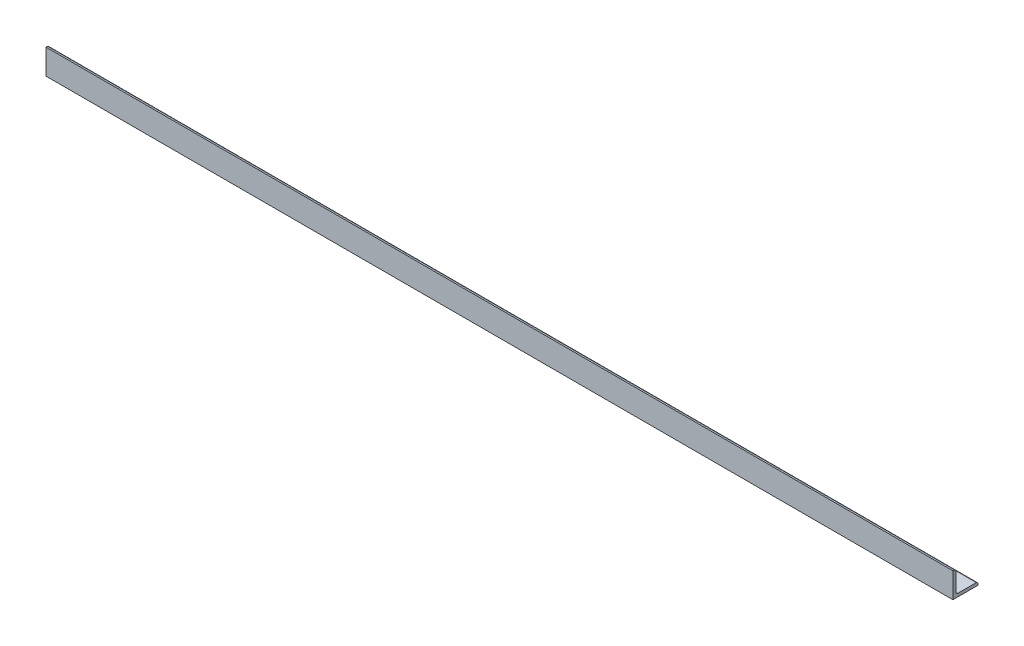
ISO-10303-21;
HEADER;
FILE_DESCRIPTION(('STEP AP214'),'2;1');
FILE_NAME('part.step','',(''),(''),'','','');
FILE_SCHEMA(('AUTOMOTIVE_DESIGN { 1 0 10303 214 1 1 1 1 }'));
ENDSEC;
DATA;
#1=APPLICATION_CONTEXT('core data for automotive mechanical design processes');
#2=APPLICATION_PROTOCOL_DEFINITION('international standard','automotive_design',2000,#1);
#3=PRODUCT_CONTEXT('',#1,'mechanical');
#4=PRODUCT('Part','Part','',(#3));
#5=PRODUCT_RELATED_PRODUCT_CATEGORY('part','',(#4));
#6=PRODUCT_DEFINITION_FORMATION('','',#4);
#7=PRODUCT_DEFINITION_CONTEXT('part definition',#1,'design');
#8=PRODUCT_DEFINITION('design','',#6,#7);
#9=PRODUCT_DEFINITION_SHAPE('','',#8);
#10=(LENGTH_UNIT() NAMED_UNIT(*) SI_UNIT(.MILLI.,.METRE.));
#11=(NAMED_UNIT(*) PLANE_ANGLE_UNIT() SI_UNIT($,.RADIAN.));
#12=(NAMED_UNIT(*) SI_UNIT($,.STERADIAN.) SOLID_ANGLE_UNIT());
#13=UNCERTAINTY_MEASURE_WITH_UNIT(LENGTH_MEASURE(1.E-05),#10,'distance_accuracy_value','');
#14=(GEOMETRIC_REPRESENTATION_CONTEXT(3) GLOBAL_UNCERTAINTY_ASSIGNED_CONTEXT((#13)) GLOBAL_UNIT_ASSIGNED_CONTEXT((#10,
#11,#12)) REPRESENTATION_CONTEXT('',''));
#15=CARTESIAN_POINT('',(0.,0.,0.));
#16=DIRECTION('',(0.,0.,1.));
#17=DIRECTION('',(1.,0.,0.));
#18=AXIS2_PLACEMENT_3D('',#15,#16,#17);
#19=CARTESIAN_POINT('',(150.460652388512,-310.689072168843,-670.15));
#20=DIRECTION('',(0.,-1.,0.));
#21=DIRECTION('',(0.,0.,-1.));
#22=AXIS2_PLACEMENT_3D('',#19,#20,#21);
#23=CYLINDRICAL_SURFACE('',#22,3.4);
#24=CARTESIAN_POINT('',(150.460652388512,-305.926572168843,-670.15));
#25=DIRECTION('',(0.,-1.,0.));
#26=DIRECTION('',(0.,0.,-1.));
#27=AXIS2_PLACEMENT_3D('',#24,#25,#26);
#28=CIRCLE('',#27,3.4);
#29=CARTESIAN_POINT('',(150.460652388512,-305.926572168843,-673.55));
#30=VERTEX_POINT('',#29);
#31=EDGE_CURVE('E20',#30,#30,#28,.F.);
#32=ORIENTED_EDGE('',*,*,#31,.T.);
#33=EDGE_LOOP('',(#32));
#34=FACE_BOUND('',#33,.T.);
#35=CARTESIAN_POINT('',(150.460652388512,-310.017902480979,-670.15));
#36=DIRECTION('',(0.,-1.,0.));
#37=DIRECTION('',(-1.,0.,0.));
#38=AXIS2_PLACEMENT_3D('',#35,#36,#37);
#39=CIRCLE('',#38,3.39999999999394);
#40=CARTESIAN_POINT('',(147.060652388518,-310.017902480979,-670.15));
#41=VERTEX_POINT('',#40);
#42=EDGE_CURVE('E177',#41,#41,#39,.T.);
#43=ORIENTED_EDGE('',*,*,#42,.T.);
#44=EDGE_LOOP('',(#43));
#45=FACE_BOUND('',#44,.T.);
#46=ADVANCED_FACE('F17',(#34,#45),#23,.F.);
#47=CARTESIAN_POINT('',(-150.489347611488,-310.689072168843,-670.15));
#48=DIRECTION('',(0.,-1.,0.));
#49=DIRECTION('',(0.,0.,-1.));
#50=AXIS2_PLACEMENT_3D('',#47,#48,#49);
#51=CYLINDRICAL_SURFACE('',#50,3.4);
#52=CARTESIAN_POINT('',(-150.489347611488,-305.926572168843,-670.15));
#53=DIRECTION('',(0.,-1.,0.));
#54=DIRECTION('',(0.,0.,-1.));
#55=AXIS2_PLACEMENT_3D('',#52,#53,#54);
#56=CIRCLE('',#55,3.4);
#57=CARTESIAN_POINT('',(-150.489347611488,-305.926572168843,-673.55));
#58=VERTEX_POINT('',#57);
#59=EDGE_CURVE('E150',#58,#58,#56,.F.);
#60=ORIENTED_EDGE('',*,*,#59,.T.);
#61=EDGE_LOOP('',(#60));
#62=FACE_BOUND('',#61,.T.);
#63=CARTESIAN_POINT('',(-150.489347611488,-310.017902480922,-670.15));
#64=DIRECTION('',(0.,-1.,0.));
#65=DIRECTION('',(-1.,0.,0.));
#66=AXIS2_PLACEMENT_3D('',#63,#64,#65);
#67=CIRCLE('',#66,3.39999999999421);
#68=CARTESIAN_POINT('',(-153.889347611482,-310.017902480922,-670.15));
#69=VERTEX_POINT('',#68);
#70=EDGE_CURVE('E101',#69,#69,#67,.T.);
#71=ORIENTED_EDGE('',*,*,#70,.T.);
#72=EDGE_LOOP('',(#71));
#73=FACE_BOUND('',#72,.T.);
#74=ADVANCED_FACE('F264',(#62,#73),#51,.F.);
#75=CARTESIAN_POINT('',(150.460652388512,-310.689072168884,-670.15));
#76=DIRECTION('',(0.,-1.,0.));
#77=DIRECTION('',(0.,0.,-1.));
#78=AXIS2_PLACEMENT_3D('',#75,#76,#77);
#79=CONICAL_SURFACE('',#78,4.56249999995792,1.04719755120111);
#80=CARTESIAN_POINT('',(150.460652388512,-310.689072168884,-670.15));
#81=DIRECTION('',(0.,-1.,0.));
#82=DIRECTION('',(0.,0.,-1.));
#83=AXIS2_PLACEMENT_3D('',#80,#81,#82);
#84=CIRCLE('',#83,4.56249999995795);
#85=CARTESIAN_POINT('',(150.460652388512,-310.689072168884,-674.712499999958));
#86=VERTEX_POINT('',#85);
#87=EDGE_CURVE('E168',#86,#86,#84,.T.);
#88=ORIENTED_EDGE('',*,*,#87,.T.);
#89=EDGE_LOOP('',(#88));
#90=FACE_BOUND('',#89,.T.);
#91=ORIENTED_EDGE('',*,*,#42,.F.);
#92=EDGE_LOOP('',(#91));
#93=FACE_BOUND('',#92,.T.);
#94=ADVANCED_FACE('F260',(#90,#93),#79,.F.);
#95=CARTESIAN_POINT('',(-150.489347611488,-310.689072168827,-670.15));
#96=DIRECTION('',(0.,-1.,0.));
#97=DIRECTION('',(0.,0.,-1.));
#98=AXIS2_PLACEMENT_3D('',#95,#96,#97);
#99=CONICAL_SURFACE('',#98,4.5624999999582,1.04719755120111);
#100=CARTESIAN_POINT('',(-150.489347611488,-310.689072168827,-670.15));
#101=DIRECTION('',(0.,-1.,0.));
#102=DIRECTION('',(0.,0.,-1.));
#103=AXIS2_PLACEMENT_3D('',#100,#101,#102);
#104=CIRCLE('',#103,4.56249999995817);
#105=CARTESIAN_POINT('',(-150.489347611488,-310.689072168827,-674.712499999958));
#106=VERTEX_POINT('',#105);
#107=EDGE_CURVE('E156',#106,#106,#104,.T.);
#108=ORIENTED_EDGE('',*,*,#107,.T.);
#109=EDGE_LOOP('',(#108));
#110=FACE_BOUND('',#109,.T.);
#111=ORIENTED_EDGE('',*,*,#70,.F.);
#112=EDGE_LOOP('',(#111));
#113=FACE_BOUND('',#112,.T.);
#114=ADVANCED_FACE('F257',(#110,#113),#99,.F.);
#115=CARTESIAN_POINT('',(551.510652388512,-305.926572168843,-690.15));
#116=DIRECTION('',(0.,0.,1.));
#117=DIRECTION('',(1.,0.,0.));
#118=AXIS2_PLACEMENT_3D('',#115,#116,#117);
#119=PLANE('',#118);
#120=DIRECTION('',(0.,1.,0.));
#121=VECTOR('',#120,1.);
#122=CARTESIAN_POINT('',(-861.589347611489,-310.689072168843,-690.15));
#123=LINE('',#122,#121);
#124=CARTESIAN_POINT('',(-861.589347611489,-308.926572168843,-690.15));
#125=VERTEX_POINT('',#124);
#126=CARTESIAN_POINT('',(-861.589347611489,-310.689072168843,-690.15));
#127=VERTEX_POINT('',#126);
#128=EDGE_CURVE('E163',#125,#127,#123,.F.);
#129=ORIENTED_EDGE('',*,*,#128,.F.);
#130=DIRECTION('',(-1.,0.,0.));
#131=VECTOR('',#130,1.);
#132=CARTESIAN_POINT('',(0.,-308.926572168843,-690.15));
#133=LINE('',#132,#131);
#134=CARTESIAN_POINT('',(514.610652388512,-308.926572168843,-690.15));
#135=VERTEX_POINT('',#134);
#136=EDGE_CURVE('E146',#135,#125,#133,.T.);
#137=ORIENTED_EDGE('',*,*,#136,.F.);
#138=DIRECTION('',(0.,1.,0.));
#139=VECTOR('',#138,1.);
#140=CARTESIAN_POINT('',(514.610652388512,-313.864072168843,-690.15));
#141=LINE('',#140,#139);
#142=CARTESIAN_POINT('',(514.610652388512,-310.689072168843,-690.15));
#143=VERTEX_POINT('',#142);
#144=EDGE_CURVE('E115',#143,#135,#141,.T.);
#145=ORIENTED_EDGE('',*,*,#144,.F.);
#146=DIRECTION('',(1.,0.,0.));
#147=VECTOR('',#146,1.);
#148=CARTESIAN_POINT('',(551.510652388512,-310.689072168843,-690.15));
#149=LINE('',#148,#147);
#150=EDGE_CURVE('E153',#143,#127,#149,.F.);
#151=ORIENTED_EDGE('',*,*,#150,.T.);
#152=EDGE_LOOP('',(#129,#137,#145,#151));
#153=FACE_BOUND('',#152,.T.);
#154=ADVANCED_FACE('F214',(#153),#119,.F.);
#155=CARTESIAN_POINT('',(551.510652388512,-272.589072168843,-656.8125));
#156=DIRECTION('',(0.,0.,1.));
#157=DIRECTION('',(1.,0.,0.));
#158=AXIS2_PLACEMENT_3D('',#155,#156,#157);
#159=PLANE('',#158);
#160=DIRECTION('',(0.,1.,0.));
#161=VECTOR('',#160,1.);
#162=CARTESIAN_POINT('',(514.610652388512,-313.864072168843,-656.8125));
#163=LINE('',#162,#161);
#164=CARTESIAN_POINT('',(514.610652388512,-302.926572168843,-656.8125));
#165=VERTEX_POINT('',#164);
#166=CARTESIAN_POINT('',(514.610652388512,-275.589072168843,-656.8125));
#167=VERTEX_POINT('',#166);
#168=EDGE_CURVE('E105',#165,#167,#163,.T.);
#169=ORIENTED_EDGE('',*,*,#168,.F.);
#170=DIRECTION('',(-1.,0.,0.));
#171=VECTOR('',#170,1.);
#172=CARTESIAN_POINT('',(0.,-302.926572168843,-656.8125));
#173=LINE('',#172,#171);
#174=CARTESIAN_POINT('',(-861.589347611489,-302.926572168843,-656.8125));
#175=VERTEX_POINT('',#174);
#176=EDGE_CURVE('E93',#165,#175,#173,.T.);
#177=ORIENTED_EDGE('',*,*,#176,.T.);
#178=DIRECTION('',(0.,1.,0.));
#179=VECTOR('',#178,1.);
#180=CARTESIAN_POINT('',(-861.589347611489,-310.689072168843,-656.8125));
#181=LINE('',#180,#179);
#182=CARTESIAN_POINT('',(-861.589347611489,-275.589072168843,-656.8125));
#183=VERTEX_POINT('',#182);
#184=EDGE_CURVE('E184',#183,#175,#181,.F.);
#185=ORIENTED_EDGE('',*,*,#184,.F.);
#186=DIRECTION('',(1.,0.,0.));
#187=VECTOR('',#186,1.);
#188=CARTESIAN_POINT('',(0.,-275.589072168843,-656.8125));
#189=LINE('',#188,#187);
#190=EDGE_CURVE('E111',#167,#183,#189,.F.);
#191=ORIENTED_EDGE('',*,*,#190,.F.);
#192=EDGE_LOOP('',(#169,#177,#185,#191));
#193=FACE_BOUND('',#192,.T.);
#194=ADVANCED_FACE('F110',(#193),#159,.F.);
#195=CARTESIAN_POINT('',(0.,-302.926572168843,-659.8125));
#196=DIRECTION('',(-1.,0.,0.));
#197=DIRECTION('',(0.,0.,1.));
#198=AXIS2_PLACEMENT_3D('',#195,#196,#197);
#199=CYLINDRICAL_SURFACE('',#198,3.);
#200=CARTESIAN_POINT('',(-861.589347611489,-302.926572168843,-659.8125));
#201=DIRECTION('',(-1.,0.,0.));
#202=DIRECTION('',(0.,0.,1.));
#203=AXIS2_PLACEMENT_3D('',#200,#201,#202);
#204=CIRCLE('',#203,3.);
#205=CARTESIAN_POINT('',(-861.589347611489,-305.926572168843,-659.8125));
#206=VERTEX_POINT('',#205);
#207=EDGE_CURVE('E97',#175,#206,#204,.F.);
#208=ORIENTED_EDGE('',*,*,#207,.F.);
#209=ORIENTED_EDGE('',*,*,#176,.F.);
#210=CARTESIAN_POINT('',(514.610652388512,-302.926572168843,-659.8125));
#211=DIRECTION('',(-1.,0.,0.));
#212=DIRECTION('',(0.,0.,1.));
#213=AXIS2_PLACEMENT_3D('',#210,#211,#212);
#214=CIRCLE('',#213,3.);
#215=CARTESIAN_POINT('',(514.610652388512,-305.926572168843,-659.8125));
#216=VERTEX_POINT('',#215);
#217=EDGE_CURVE('E96',#216,#165,#214,.T.);
#218=ORIENTED_EDGE('',*,*,#217,.F.);
#219=DIRECTION('',(1.,0.,0.));
#220=VECTOR('',#219,1.);
#221=CARTESIAN_POINT('',(551.510652388512,-305.926572168843,-659.8125));
#222=LINE('',#221,#220);
#223=EDGE_CURVE('E86',#216,#206,#222,.F.);
#224=ORIENTED_EDGE('',*,*,#223,.T.);
#225=EDGE_LOOP('',(#208,#209,#218,#224));
#226=FACE_BOUND('',#225,.T.);
#227=ADVANCED_FACE('F95',(#226),#199,.F.);
#228=CARTESIAN_POINT('',(551.510652388512,-305.926572168843,-656.8125));
#229=DIRECTION('',(0.,-1.,0.));
#230=DIRECTION('',(0.,0.,-1.));
#231=AXIS2_PLACEMENT_3D('',#228,#229,#230);
#232=PLANE('',#231);
#233=ORIENTED_EDGE('',*,*,#59,.F.);
#234=EDGE_LOOP('',(#233));
#235=FACE_BOUND('',#234,.T.);
#236=ORIENTED_EDGE('',*,*,#31,.F.);
#237=EDGE_LOOP('',(#236));
#238=FACE_BOUND('',#237,.T.);
#239=DIRECTION('',(0.,0.,-1.));
#240=VECTOR('',#239,1.);
#241=CARTESIAN_POINT('',(514.610652388512,-305.926572168843,-133.95));
#242=LINE('',#241,#240);
#243=CARTESIAN_POINT('',(514.610652388512,-305.926572168843,-687.15));
#244=VERTEX_POINT('',#243);
#245=EDGE_CURVE('E108',#244,#216,#242,.F.);
#246=ORIENTED_EDGE('',*,*,#245,.F.);
#247=DIRECTION('',(-1.,0.,0.));
#248=VECTOR('',#247,1.);
#249=CARTESIAN_POINT('',(0.,-305.926572168843,-687.15));
#250=LINE('',#249,#248);
#251=CARTESIAN_POINT('',(-861.589347611489,-305.926572168843,-687.15));
#252=VERTEX_POINT('',#251);
#253=EDGE_CURVE('E148',#252,#244,#250,.F.);
#254=ORIENTED_EDGE('',*,*,#253,.F.);
#255=DIRECTION('',(0.,0.,1.));
#256=VECTOR('',#255,1.);
#257=CARTESIAN_POINT('',(-861.589347611489,-305.926572168843,-793.95));
#258=LINE('',#257,#256);
#259=EDGE_CURVE('E182',#206,#252,#258,.F.);
#260=ORIENTED_EDGE('',*,*,#259,.F.);
#261=ORIENTED_EDGE('',*,*,#223,.F.);
#262=EDGE_LOOP('',(#246,#254,#260,#261));
#263=FACE_BOUND('',#262,.T.);
#264=ADVANCED_FACE('F200',(#235,#238,#263),#232,.F.);
#265=CARTESIAN_POINT('',(0.,-308.926572168843,-687.15));
#266=DIRECTION('',(-1.,0.,0.));
#267=DIRECTION('',(0.,0.,1.));
#268=AXIS2_PLACEMENT_3D('',#265,#266,#267);
#269=CYLINDRICAL_SURFACE('',#268,3.);
#270=ORIENTED_EDGE('',*,*,#136,.T.);
#271=CARTESIAN_POINT('',(-861.589347611489,-308.926572168843,-687.15));
#272=DIRECTION('',(-1.,0.,0.));
#273=DIRECTION('',(0.,0.,1.));
#274=AXIS2_PLACEMENT_3D('',#271,#272,#273);
#275=CIRCLE('',#274,3.);
#276=EDGE_CURVE('E139',#252,#125,#275,.T.);
#277=ORIENTED_EDGE('',*,*,#276,.F.);
#278=ORIENTED_EDGE('',*,*,#253,.T.);
#279=CARTESIAN_POINT('',(514.610652388512,-308.926572168843,-687.15));
#280=DIRECTION('',(-1.,0.,0.));
#281=DIRECTION('',(0.,0.,1.));
#282=AXIS2_PLACEMENT_3D('',#279,#280,#281);
#283=CIRCLE('',#282,3.);
#284=EDGE_CURVE('E191',#135,#244,#283,.F.);
#285=ORIENTED_EDGE('',*,*,#284,.F.);
#286=EDGE_LOOP('',(#270,#277,#278,#285));
#287=FACE_BOUND('',#286,.T.);
#288=ADVANCED_FACE('F202',(#287),#269,.T.);
#289=CARTESIAN_POINT('',(0.,-275.589072168843,-653.8125));
#290=DIRECTION('',(1.,0.,0.));
#291=DIRECTION('',(0.,0.,-1.));
#292=AXIS2_PLACEMENT_3D('',#289,#290,#291);
#293=CYLINDRICAL_SURFACE('',#292,3.);
#294=DIRECTION('',(1.,0.,0.));
#295=VECTOR('',#294,1.);
#296=CARTESIAN_POINT('',(551.510652388512,-272.589072168843,-653.8125));
#297=LINE('',#296,#295);
#298=CARTESIAN_POINT('',(-861.589347611489,-272.589072168843,-653.8125));
#299=VERTEX_POINT('',#298);
#300=CARTESIAN_POINT('',(514.610652388512,-272.589072168843,-653.8125));
#301=VERTEX_POINT('',#300);
#302=EDGE_CURVE('E122',#299,#301,#297,.T.);
#303=ORIENTED_EDGE('',*,*,#302,.T.);
#304=CARTESIAN_POINT('',(514.610652388512,-275.589072168843,-653.8125));
#305=DIRECTION('',(1.,0.,0.));
#306=DIRECTION('',(0.,0.,-1.));
#307=AXIS2_PLACEMENT_3D('',#304,#305,#306);
#308=CIRCLE('',#307,3.);
#309=EDGE_CURVE('E113',#167,#301,#308,.T.);
#310=ORIENTED_EDGE('',*,*,#309,.F.);
#311=ORIENTED_EDGE('',*,*,#190,.T.);
#312=CARTESIAN_POINT('',(-861.589347611489,-275.589072168843,-653.8125));
#313=DIRECTION('',(1.,0.,0.));
#314=DIRECTION('',(0.,0.,-1.));
#315=AXIS2_PLACEMENT_3D('',#312,#313,#314);
#316=CIRCLE('',#315,3.);
#317=EDGE_CURVE('E162',#299,#183,#316,.F.);
#318=ORIENTED_EDGE('',*,*,#317,.F.);
#319=EDGE_LOOP('',(#303,#310,#311,#318));
#320=FACE_BOUND('',#319,.T.);
#321=ADVANCED_FACE('F232',(#320),#293,.T.);
#322=CARTESIAN_POINT('',(514.610652388512,-313.864072168843,-133.95));
#323=DIRECTION('',(1.,0.,0.));
#324=DIRECTION('',(0.,0.,-1.));
#325=AXIS2_PLACEMENT_3D('',#322,#323,#324);
#326=PLANE('',#325);
#327=ORIENTED_EDGE('',*,*,#144,.T.);
#328=ORIENTED_EDGE('',*,*,#284,.T.);
#329=ORIENTED_EDGE('',*,*,#245,.T.);
#330=ORIENTED_EDGE('',*,*,#217,.T.);
#331=ORIENTED_EDGE('',*,*,#168,.T.);
#332=ORIENTED_EDGE('',*,*,#309,.T.);
#333=DIRECTION('',(0.,0.,-1.));
#334=VECTOR('',#333,1.);
#335=CARTESIAN_POINT('',(514.610652388512,-272.589072168843,-652.05));
#336=LINE('',#335,#334);
#337=CARTESIAN_POINT('',(514.610652388512,-272.589072168843,-652.05));
#338=VERTEX_POINT('',#337);
#339=EDGE_CURVE('E127',#301,#338,#336,.F.);
#340=ORIENTED_EDGE('',*,*,#339,.T.);
#341=DIRECTION('',(0.,1.,0.));
#342=VECTOR('',#341,1.);
#343=CARTESIAN_POINT('',(514.610652388512,-310.689072168843,-652.05));
#344=LINE('',#343,#342);
#345=CARTESIAN_POINT('',(514.610652388512,-310.689072168843,-652.05));
#346=VERTEX_POINT('',#345);
#347=EDGE_CURVE('E125',#338,#346,#344,.F.);
#348=ORIENTED_EDGE('',*,*,#347,.T.);
#349=DIRECTION('',(0.,0.,1.));
#350=VECTOR('',#349,1.);
#351=CARTESIAN_POINT('',(514.610652388512,-310.689072168843,-690.15));
#352=LINE('',#351,#350);
#353=EDGE_CURVE('E157',#346,#143,#352,.F.);
#354=ORIENTED_EDGE('',*,*,#353,.T.);
#355=EDGE_LOOP('',(#327,#328,#329,#330,#331,#332,#340,#348,#354));
#356=FACE_BOUND('',#355,.T.);
#357=ADVANCED_FACE('F104',(#356),#326,.T.);
#358=CARTESIAN_POINT('',(551.510652388512,-310.689072168843,-690.15));
#359=DIRECTION('',(0.,1.,0.));
#360=DIRECTION('',(0.,0.,1.));
#361=AXIS2_PLACEMENT_3D('',#358,#359,#360);
#362=PLANE('',#361);
#363=ORIENTED_EDGE('',*,*,#107,.F.);
#364=EDGE_LOOP('',(#363));
#365=FACE_BOUND('',#364,.T.);
#366=DIRECTION('',(0.,0.,1.));
#367=VECTOR('',#366,1.);
#368=CARTESIAN_POINT('',(-861.589347611489,-310.689072168843,-793.95));
#369=LINE('',#368,#367);
#370=CARTESIAN_POINT('',(-861.589347611489,-310.689072168843,-652.05));
#371=VERTEX_POINT('',#370);
#372=EDGE_CURVE('E160',#127,#371,#369,.T.);
#373=ORIENTED_EDGE('',*,*,#372,.F.);
#374=ORIENTED_EDGE('',*,*,#150,.F.);
#375=ORIENTED_EDGE('',*,*,#353,.F.);
#376=DIRECTION('',(-1.,0.,0.));
#377=VECTOR('',#376,1.);
#378=CARTESIAN_POINT('',(551.510652388512,-310.689072168843,-652.05));
#379=LINE('',#378,#377);
#380=EDGE_CURVE('E134',#346,#371,#379,.T.);
#381=ORIENTED_EDGE('',*,*,#380,.T.);
#382=EDGE_LOOP('',(#373,#374,#375,#381));
#383=FACE_BOUND('',#382,.T.);
#384=ORIENTED_EDGE('',*,*,#87,.F.);
#385=EDGE_LOOP('',(#384));
#386=FACE_BOUND('',#385,.T.);
#387=ADVANCED_FACE('F223',(#365,#383,#386),#362,.F.);
#388=CARTESIAN_POINT('',(-861.589347611489,-310.689072168843,-793.95));
#389=DIRECTION('',(-1.,0.,0.));
#390=DIRECTION('',(0.,0.,1.));
#391=AXIS2_PLACEMENT_3D('',#388,#389,#390);
#392=PLANE('',#391);
#393=ORIENTED_EDGE('',*,*,#259,.T.);
#394=ORIENTED_EDGE('',*,*,#276,.T.);
#395=ORIENTED_EDGE('',*,*,#128,.T.);
#396=ORIENTED_EDGE('',*,*,#372,.T.);
#397=DIRECTION('',(0.,1.,0.));
#398=VECTOR('',#397,1.);
#399=CARTESIAN_POINT('',(-861.589347611489,-310.689072168843,-652.05));
#400=LINE('',#399,#398);
#401=CARTESIAN_POINT('',(-861.589347611489,-272.589072168843,-652.05));
#402=VERTEX_POINT('',#401);
#403=EDGE_CURVE('E26',#371,#402,#400,.T.);
#404=ORIENTED_EDGE('',*,*,#403,.T.);
#405=DIRECTION('',(0.,0.,-1.));
#406=VECTOR('',#405,1.);
#407=CARTESIAN_POINT('',(-861.589347611489,-272.589072168843,-652.05));
#408=LINE('',#407,#406);
#409=EDGE_CURVE('E34',#402,#299,#408,.T.);
#410=ORIENTED_EDGE('',*,*,#409,.T.);
#411=ORIENTED_EDGE('',*,*,#317,.T.);
#412=ORIENTED_EDGE('',*,*,#184,.T.);
#413=ORIENTED_EDGE('',*,*,#207,.T.);
#414=EDGE_LOOP('',(#393,#394,#395,#396,#404,#410,#411,#412,#413));
#415=FACE_BOUND('',#414,.T.);
#416=ADVANCED_FACE('F212',(#415),#392,.T.);
#417=CARTESIAN_POINT('',(551.510652388512,-272.589072168843,-652.05));
#418=DIRECTION('',(0.,-1.,0.));
#419=DIRECTION('',(0.,0.,-1.));
#420=AXIS2_PLACEMENT_3D('',#417,#418,#419);
#421=PLANE('',#420);
#422=ORIENTED_EDGE('',*,*,#409,.F.);
#423=DIRECTION('',(-1.,0.,0.));
#424=VECTOR('',#423,1.);
#425=CARTESIAN_POINT('',(551.510652388512,-272.589072168843,-652.05));
#426=LINE('',#425,#424);
#427=EDGE_CURVE('E11',#402,#338,#426,.F.);
#428=ORIENTED_EDGE('',*,*,#427,.T.);
#429=ORIENTED_EDGE('',*,*,#339,.F.);
#430=ORIENTED_EDGE('',*,*,#302,.F.);
#431=EDGE_LOOP('',(#422,#428,#429,#430));
#432=FACE_BOUND('',#431,.T.);
#433=ADVANCED_FACE('F230',(#432),#421,.F.);
#434=CARTESIAN_POINT('',(551.510652388512,-310.689072168843,-652.05));
#435=DIRECTION('',(0.,0.,-1.));
#436=DIRECTION('',(-1.,0.,0.));
#437=AXIS2_PLACEMENT_3D('',#434,#435,#436);
#438=PLANE('',#437);
#439=ORIENTED_EDGE('',*,*,#403,.F.);
#440=ORIENTED_EDGE('',*,*,#380,.F.);
#441=ORIENTED_EDGE('',*,*,#347,.F.);
#442=ORIENTED_EDGE('',*,*,#427,.F.);
#443=EDGE_LOOP('',(#439,#440,#441,#442));
#444=FACE_BOUND('',#443,.T.);
#445=ADVANCED_FACE('F228',(#444),#438,.F.);
#446=CLOSED_SHELL('',(#46,#74,#94,#114,#154,#194,#227,#264,#288,#321,#357,#387,#416,#433,#445));
#447=MANIFOLD_SOLID_BREP('B1',#446);
#448=ADVANCED_BREP_SHAPE_REPRESENTATION('',(#18,#447),#14);
#449=SHAPE_DEFINITION_REPRESENTATION(#9,#448);
ENDSEC;
END-ISO-10303-21;
